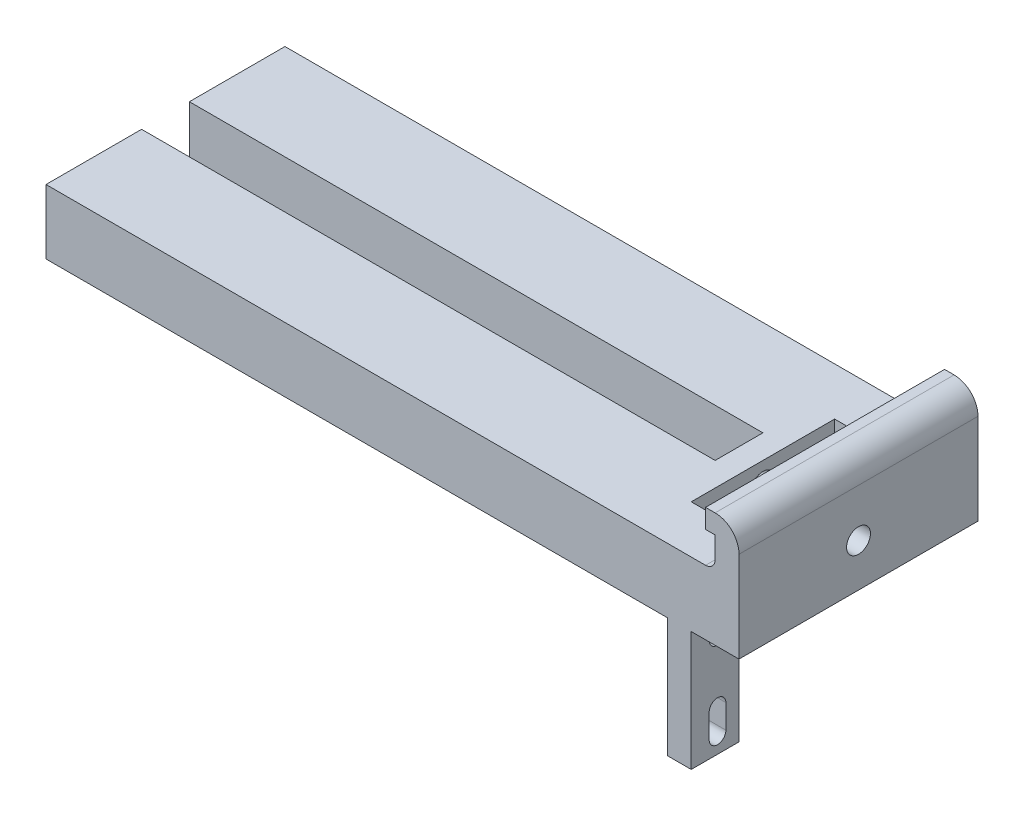
ISO-10303-21;
HEADER;
FILE_DESCRIPTION(('STEP AP214'),'2;1');
FILE_NAME('part.step','',(''),(''),'','','');
FILE_SCHEMA(('AUTOMOTIVE_DESIGN { 1 0 10303 214 1 1 1 1 }'));
ENDSEC;
DATA;
#1=APPLICATION_CONTEXT('core data for automotive mechanical design processes');
#2=APPLICATION_PROTOCOL_DEFINITION('international standard','automotive_design',2000,#1);
#3=PRODUCT_CONTEXT('',#1,'mechanical');
#4=PRODUCT('Part','Part','',(#3));
#5=PRODUCT_RELATED_PRODUCT_CATEGORY('part','',(#4));
#6=PRODUCT_DEFINITION_FORMATION('','',#4);
#7=PRODUCT_DEFINITION_CONTEXT('part definition',#1,'design');
#8=PRODUCT_DEFINITION('design','',#6,#7);
#9=PRODUCT_DEFINITION_SHAPE('','',#8);
#10=(LENGTH_UNIT() NAMED_UNIT(*) SI_UNIT(.MILLI.,.METRE.));
#11=(NAMED_UNIT(*) PLANE_ANGLE_UNIT() SI_UNIT($,.RADIAN.));
#12=(NAMED_UNIT(*) SI_UNIT($,.STERADIAN.) SOLID_ANGLE_UNIT());
#13=UNCERTAINTY_MEASURE_WITH_UNIT(LENGTH_MEASURE(1.E-05),#10,'distance_accuracy_value','');
#14=(GEOMETRIC_REPRESENTATION_CONTEXT(3) GLOBAL_UNCERTAINTY_ASSIGNED_CONTEXT((#13)) GLOBAL_UNIT_ASSIGNED_CONTEXT((#10,
#11,#12)) REPRESENTATION_CONTEXT('',''));
#15=CARTESIAN_POINT('',(0.,0.,0.));
#16=DIRECTION('',(0.,0.,1.));
#17=DIRECTION('',(1.,0.,0.));
#18=AXIS2_PLACEMENT_3D('',#15,#16,#17);
#19=CARTESIAN_POINT('',(0.,0.,50.));
#20=DIRECTION('',(0.,1.,0.));
#21=DIRECTION('',(0.,0.,1.));
#22=AXIS2_PLACEMENT_3D('',#19,#20,#21);
#23=PLANE('',#22);
#24=DIRECTION('',(0.,0.,1.));
#25=VECTOR('',#24,1.);
#26=CARTESIAN_POINT('',(-5.,0.,40.));
#27=LINE('',#26,#25);
#28=CARTESIAN_POINT('',(-5.,0.,40.));
#29=VERTEX_POINT('',#28);
#30=CARTESIAN_POINT('',(-5.,0.,50.));
#31=VERTEX_POINT('',#30);
#32=EDGE_CURVE('E351',#29,#31,#27,.T.);
#33=ORIENTED_EDGE('',*,*,#32,.F.);
#34=DIRECTION('',(0.,0.,-1.));
#35=VECTOR('',#34,1.);
#36=CARTESIAN_POINT('',(-5.,0.,50.));
#37=LINE('',#36,#35);
#38=CARTESIAN_POINT('',(-5.,0.,10.));
#39=VERTEX_POINT('',#38);
#40=EDGE_CURVE('E312',#29,#39,#37,.T.);
#41=ORIENTED_EDGE('',*,*,#40,.T.);
#42=DIRECTION('',(-1.,0.,0.));
#43=VECTOR('',#42,1.);
#44=CARTESIAN_POINT('',(0.,0.,10.));
#45=LINE('',#44,#43);
#46=CARTESIAN_POINT('',(-15.,0.,10.));
#47=VERTEX_POINT('',#46);
#48=EDGE_CURVE('E309',#39,#47,#45,.T.);
#49=ORIENTED_EDGE('',*,*,#48,.T.);
#50=DIRECTION('',(0.,0.,1.));
#51=VECTOR('',#50,1.);
#52=CARTESIAN_POINT('',(-15.,0.,50.));
#53=LINE('',#52,#51);
#54=CARTESIAN_POINT('',(-15.,0.,40.));
#55=VERTEX_POINT('',#54);
#56=EDGE_CURVE('E212',#47,#55,#53,.T.);
#57=ORIENTED_EDGE('',*,*,#56,.T.);
#58=DIRECTION('',(1.,0.,0.));
#59=VECTOR('',#58,1.);
#60=CARTESIAN_POINT('',(0.,0.,40.));
#61=LINE('',#60,#59);
#62=CARTESIAN_POINT('',(-10.,0.,40.));
#63=VERTEX_POINT('',#62);
#64=EDGE_CURVE('E315',#55,#63,#61,.T.);
#65=ORIENTED_EDGE('',*,*,#64,.T.);
#66=DIRECTION('',(0.,0.,-1.));
#67=VECTOR('',#66,1.);
#68=CARTESIAN_POINT('',(-10.,0.,40.));
#69=LINE('',#68,#67);
#70=CARTESIAN_POINT('',(-10.,0.,50.));
#71=VERTEX_POINT('',#70);
#72=EDGE_CURVE('E356',#71,#63,#69,.T.);
#73=ORIENTED_EDGE('',*,*,#72,.F.);
#74=DIRECTION('',(1.,0.,0.));
#75=VECTOR('',#74,1.);
#76=CARTESIAN_POINT('',(0.,0.,50.));
#77=LINE('',#76,#75);
#78=CARTESIAN_POINT('',(-140.,0.,50.));
#79=VERTEX_POINT('',#78);
#80=EDGE_CURVE('E293',#79,#71,#77,.T.);
#81=ORIENTED_EDGE('',*,*,#80,.F.);
#82=DIRECTION('',(0.,0.,-1.));
#83=VECTOR('',#82,1.);
#84=CARTESIAN_POINT('',(-140.,0.,50.));
#85=LINE('',#84,#83);
#86=CARTESIAN_POINT('',(-140.,0.,30.));
#87=VERTEX_POINT('',#86);
#88=EDGE_CURVE('E302',#79,#87,#85,.T.);
#89=ORIENTED_EDGE('',*,*,#88,.T.);
#90=DIRECTION('',(1.,0.,0.));
#91=VECTOR('',#90,1.);
#92=CARTESIAN_POINT('',(-140.,0.,30.));
#93=LINE('',#92,#91);
#94=CARTESIAN_POINT('',(-20.,0.,30.));
#95=VERTEX_POINT('',#94);
#96=EDGE_CURVE('E377',#87,#95,#93,.T.);
#97=ORIENTED_EDGE('',*,*,#96,.T.);
#98=DIRECTION('',(0.,0.,-1.));
#99=VECTOR('',#98,1.);
#100=CARTESIAN_POINT('',(-20.,0.,19.9999999999999));
#101=LINE('',#100,#99);
#102=CARTESIAN_POINT('',(-20.,0.,19.9999999999999));
#103=VERTEX_POINT('',#102);
#104=EDGE_CURVE('E380',#95,#103,#101,.T.);
#105=ORIENTED_EDGE('',*,*,#104,.T.);
#106=DIRECTION('',(-1.,0.,0.));
#107=VECTOR('',#106,1.);
#108=CARTESIAN_POINT('',(-140.,0.,20.));
#109=LINE('',#108,#107);
#110=CARTESIAN_POINT('',(-140.,0.,20.));
#111=VERTEX_POINT('',#110);
#112=EDGE_CURVE('E383',#103,#111,#109,.T.);
#113=ORIENTED_EDGE('',*,*,#112,.T.);
#114=CARTESIAN_POINT('',(-140.,0.,0.));
#115=VERTEX_POINT('',#114);
#116=EDGE_CURVE('E296',#111,#115,#85,.T.);
#117=ORIENTED_EDGE('',*,*,#116,.T.);
#118=DIRECTION('',(1.,0.,0.));
#119=VECTOR('',#118,1.);
#120=CARTESIAN_POINT('',(0.,0.,0.));
#121=LINE('',#120,#119);
#122=CARTESIAN_POINT('',(5.,0.,0.));
#123=VERTEX_POINT('',#122);
#124=EDGE_CURVE('E291',#115,#123,#121,.T.);
#125=ORIENTED_EDGE('',*,*,#124,.T.);
#126=DIRECTION('',(0.,0.,-1.));
#127=VECTOR('',#126,1.);
#128=CARTESIAN_POINT('',(5.,0.,0.));
#129=LINE('',#128,#127);
#130=CARTESIAN_POINT('',(5.,0.,50.));
#131=VERTEX_POINT('',#130);
#132=EDGE_CURVE('E264',#131,#123,#129,.T.);
#133=ORIENTED_EDGE('',*,*,#132,.F.);
#134=EDGE_CURVE('E258',#31,#131,#77,.T.);
#135=ORIENTED_EDGE('',*,*,#134,.F.);
#136=EDGE_LOOP('',(#33,#41,#49,#57,#65,#73,#81,#89,#97,#105,#113,#117,#125,#133,#135));
#137=FACE_BOUND('',#136,.T.);
#138=ADVANCED_FACE('F33',(#137),#23,.F.);
#139=CARTESIAN_POINT('',(-140.,0.,50.));
#140=DIRECTION('',(1.,0.,0.));
#141=DIRECTION('',(0.,0.,-1.));
#142=AXIS2_PLACEMENT_3D('',#139,#140,#141);
#143=PLANE('',#142);
#144=CARTESIAN_POINT('',(-140.,6.75,12.5));
#145=DIRECTION('',(-1.,0.,0.));
#146=DIRECTION('',(0.,0.,1.));
#147=AXIS2_PLACEMENT_3D('',#144,#145,#146);
#148=CIRCLE('',#147,3.);
#149=CARTESIAN_POINT('',(-140.,6.75,15.5));
#150=VERTEX_POINT('',#149);
#151=EDGE_CURVE('E280',#150,#150,#148,.T.);
#152=ORIENTED_EDGE('',*,*,#151,.F.);
#153=EDGE_LOOP('',(#152));
#154=FACE_BOUND('',#153,.T.);
#155=ORIENTED_EDGE('',*,*,#116,.F.);
#156=DIRECTION('',(0.,1.,0.));
#157=VECTOR('',#156,1.);
#158=CARTESIAN_POINT('',(-140.,0.,20.));
#159=LINE('',#158,#157);
#160=CARTESIAN_POINT('',(-140.,13.5,20.));
#161=VERTEX_POINT('',#160);
#162=EDGE_CURVE('E327',#111,#161,#159,.T.);
#163=ORIENTED_EDGE('',*,*,#162,.T.);
#164=DIRECTION('',(0.,0.,-1.));
#165=VECTOR('',#164,1.);
#166=CARTESIAN_POINT('',(-140.,13.5,50.));
#167=LINE('',#166,#165);
#168=CARTESIAN_POINT('',(-140.,13.5,0.));
#169=VERTEX_POINT('',#168);
#170=EDGE_CURVE('E305',#161,#169,#167,.T.);
#171=ORIENTED_EDGE('',*,*,#170,.T.);
#172=DIRECTION('',(0.,-1.,0.));
#173=VECTOR('',#172,1.);
#174=CARTESIAN_POINT('',(-140.,0.,0.));
#175=LINE('',#174,#173);
#176=EDGE_CURVE('E298',#169,#115,#175,.T.);
#177=ORIENTED_EDGE('',*,*,#176,.T.);
#178=EDGE_LOOP('',(#155,#163,#171,#177));
#179=FACE_BOUND('',#178,.T.);
#180=ADVANCED_FACE('F461',(#154,#179),#143,.F.);
#181=CARTESIAN_POINT('',(0.,0.,0.));
#182=DIRECTION('',(-1.,0.,0.));
#183=DIRECTION('',(0.,-1.,0.));
#184=AXIS2_PLACEMENT_3D('',#181,#182,#183);
#185=PLANE('',#184);
#186=DIRECTION('',(0.,1.,0.));
#187=VECTOR('',#186,1.);
#188=CARTESIAN_POINT('',(0.,0.,0.));
#189=LINE('',#188,#187);
#190=CARTESIAN_POINT('',(0.,15.5,0.));
#191=VERTEX_POINT('',#190);
#192=CARTESIAN_POINT('',(0.,20.,0.));
#193=VERTEX_POINT('',#192);
#194=EDGE_CURVE('E268',#191,#193,#189,.T.);
#195=ORIENTED_EDGE('',*,*,#194,.F.);
#196=DIRECTION('',(0.,0.,-1.));
#197=VECTOR('',#196,1.);
#198=CARTESIAN_POINT('',(0.,15.5,0.));
#199=LINE('',#198,#197);
#200=CARTESIAN_POINT('',(0.,15.5,50.));
#201=VERTEX_POINT('',#200);
#202=EDGE_CURVE('E236',#191,#201,#199,.F.);
#203=ORIENTED_EDGE('',*,*,#202,.T.);
#204=DIRECTION('',(0.,-1.,0.));
#205=VECTOR('',#204,1.);
#206=CARTESIAN_POINT('',(0.,0.,50.));
#207=LINE('',#206,#205);
#208=CARTESIAN_POINT('',(0.,20.,50.));
#209=VERTEX_POINT('',#208);
#210=EDGE_CURVE('E270',#209,#201,#207,.T.);
#211=ORIENTED_EDGE('',*,*,#210,.F.);
#212=DIRECTION('',(0.,0.,1.));
#213=VECTOR('',#212,1.);
#214=CARTESIAN_POINT('',(0.,20.,50.));
#215=LINE('',#214,#213);
#216=EDGE_CURVE('E404',#193,#209,#215,.T.);
#217=ORIENTED_EDGE('',*,*,#216,.F.);
#218=EDGE_LOOP('',(#195,#203,#211,#217));
#219=FACE_BOUND('',#218,.T.);
#220=ADVANCED_FACE('F466',(#219),#185,.T.);
#221=CARTESIAN_POINT('',(-140.,13.5,50.));
#222=DIRECTION('',(0.,-1.,0.));
#223=DIRECTION('',(0.,0.,-1.));
#224=AXIS2_PLACEMENT_3D('',#221,#222,#223);
#225=PLANE('',#224);
#226=DIRECTION('',(-1.,0.,0.));
#227=VECTOR('',#226,1.);
#228=CARTESIAN_POINT('',(-140.,13.5,40.));
#229=LINE('',#228,#227);
#230=CARTESIAN_POINT('',(-5.,13.5,40.));
#231=VERTEX_POINT('',#230);
#232=CARTESIAN_POINT('',(-15.,13.5,40.));
#233=VERTEX_POINT('',#232);
#234=EDGE_CURVE('E443',#231,#233,#229,.T.);
#235=ORIENTED_EDGE('',*,*,#234,.T.);
#236=DIRECTION('',(0.,0.,-1.));
#237=VECTOR('',#236,1.);
#238=CARTESIAN_POINT('',(-15.,13.5,50.));
#239=LINE('',#238,#237);
#240=CARTESIAN_POINT('',(-15.,13.5,10.));
#241=VERTEX_POINT('',#240);
#242=EDGE_CURVE('E271',#233,#241,#239,.T.);
#243=ORIENTED_EDGE('',*,*,#242,.T.);
#244=DIRECTION('',(1.,0.,0.));
#245=VECTOR('',#244,1.);
#246=CARTESIAN_POINT('',(-140.,13.5,10.));
#247=LINE('',#246,#245);
#248=CARTESIAN_POINT('',(-5.,13.5,10.));
#249=VERTEX_POINT('',#248);
#250=EDGE_CURVE('E430',#241,#249,#247,.T.);
#251=ORIENTED_EDGE('',*,*,#250,.T.);
#252=DIRECTION('',(0.,0.,1.));
#253=VECTOR('',#252,1.);
#254=CARTESIAN_POINT('',(-5.,13.5,50.));
#255=LINE('',#254,#253);
#256=EDGE_CURVE('E440',#249,#231,#255,.T.);
#257=ORIENTED_EDGE('',*,*,#256,.T.);
#258=EDGE_LOOP('',(#235,#243,#251,#257));
#259=FACE_BOUND('',#258,.T.);
#260=DIRECTION('',(-1.,0.,0.));
#261=VECTOR('',#260,1.);
#262=CARTESIAN_POINT('',(-140.,13.5,50.));
#263=LINE('',#262,#261);
#264=CARTESIAN_POINT('',(-2.,13.5,50.));
#265=VERTEX_POINT('',#264);
#266=CARTESIAN_POINT('',(-140.,13.5,50.));
#267=VERTEX_POINT('',#266);
#268=EDGE_CURVE('E288',#265,#267,#263,.T.);
#269=ORIENTED_EDGE('',*,*,#268,.F.);
#270=DIRECTION('',(0.,0.,-1.));
#271=VECTOR('',#270,1.);
#272=CARTESIAN_POINT('',(-2.,13.5,50.));
#273=LINE('',#272,#271);
#274=CARTESIAN_POINT('',(-2.,13.5,0.));
#275=VERTEX_POINT('',#274);
#276=EDGE_CURVE('E233',#265,#275,#273,.T.);
#277=ORIENTED_EDGE('',*,*,#276,.T.);
#278=DIRECTION('',(-1.,0.,0.));
#279=VECTOR('',#278,1.);
#280=CARTESIAN_POINT('',(-140.,13.5,0.));
#281=LINE('',#280,#279);
#282=EDGE_CURVE('E279',#275,#169,#281,.T.);
#283=ORIENTED_EDGE('',*,*,#282,.T.);
#284=ORIENTED_EDGE('',*,*,#170,.F.);
#285=DIRECTION('',(1.,0.,0.));
#286=VECTOR('',#285,1.);
#287=CARTESIAN_POINT('',(-140.,13.5,20.));
#288=LINE('',#287,#286);
#289=CARTESIAN_POINT('',(-20.,13.5,19.9999999999999));
#290=VERTEX_POINT('',#289);
#291=EDGE_CURVE('E401',#161,#290,#288,.T.);
#292=ORIENTED_EDGE('',*,*,#291,.T.);
#293=DIRECTION('',(0.,0.,1.));
#294=VECTOR('',#293,1.);
#295=CARTESIAN_POINT('',(-20.,13.5,50.));
#296=LINE('',#295,#294);
#297=CARTESIAN_POINT('',(-20.,13.5,30.));
#298=VERTEX_POINT('',#297);
#299=EDGE_CURVE('E326',#290,#298,#296,.T.);
#300=ORIENTED_EDGE('',*,*,#299,.T.);
#301=DIRECTION('',(-1.,0.,0.));
#302=VECTOR('',#301,1.);
#303=CARTESIAN_POINT('',(-140.,13.5,30.));
#304=LINE('',#303,#302);
#305=CARTESIAN_POINT('',(-140.,13.5,30.));
#306=VERTEX_POINT('',#305);
#307=EDGE_CURVE('E398',#298,#306,#304,.T.);
#308=ORIENTED_EDGE('',*,*,#307,.T.);
#309=EDGE_CURVE('E306',#267,#306,#167,.T.);
#310=ORIENTED_EDGE('',*,*,#309,.F.);
#311=EDGE_LOOP('',(#269,#277,#283,#284,#292,#300,#308,#310));
#312=FACE_BOUND('',#311,.T.);
#313=ADVANCED_FACE('F474',(#259,#312),#225,.F.);
#314=CARTESIAN_POINT('',(-140.,6.75,37.5));
#315=DIRECTION('',(-1.,0.,0.));
#316=DIRECTION('',(0.,0.,1.));
#317=AXIS2_PLACEMENT_3D('',#314,#315,#316);
#318=CIRCLE('',#317,3.);
#319=CARTESIAN_POINT('',(-140.,6.75,40.5));
#320=VERTEX_POINT('',#319);
#321=EDGE_CURVE('E275',#320,#320,#318,.T.);
#322=ORIENTED_EDGE('',*,*,#321,.F.);
#323=EDGE_LOOP('',(#322));
#324=FACE_BOUND('',#323,.T.);
#325=ORIENTED_EDGE('',*,*,#309,.T.);
#326=DIRECTION('',(0.,1.,0.));
#327=VECTOR('',#326,1.);
#328=CARTESIAN_POINT('',(-140.,0.,30.));
#329=LINE('',#328,#327);
#330=EDGE_CURVE('E386',#87,#306,#329,.T.);
#331=ORIENTED_EDGE('',*,*,#330,.F.);
#332=ORIENTED_EDGE('',*,*,#88,.F.);
#333=DIRECTION('',(0.,-1.,0.));
#334=VECTOR('',#333,1.);
#335=CARTESIAN_POINT('',(-140.,0.,50.));
#336=LINE('',#335,#334);
#337=EDGE_CURVE('E290',#267,#79,#336,.T.);
#338=ORIENTED_EDGE('',*,*,#337,.F.);
#339=EDGE_LOOP('',(#325,#331,#332,#338));
#340=FACE_BOUND('',#339,.T.);
#341=ADVANCED_FACE('F469',(#324,#340),#143,.F.);
#342=CARTESIAN_POINT('',(0.,0.,50.));
#343=DIRECTION('',(0.,0.,-1.));
#344=DIRECTION('',(-1.,0.,0.));
#345=AXIS2_PLACEMENT_3D('',#342,#343,#344);
#346=PLANE('',#345);
#347=DIRECTION('',(0.,-1.,0.));
#348=VECTOR('',#347,1.);
#349=CARTESIAN_POINT('',(5.,0.,50.));
#350=LINE('',#349,#348);
#351=CARTESIAN_POINT('',(5.,19.,50.));
#352=VERTEX_POINT('',#351);
#353=EDGE_CURVE('E250',#352,#131,#350,.T.);
#354=ORIENTED_EDGE('',*,*,#353,.F.);
#355=CARTESIAN_POINT('',(0.,19.,50.));
#356=DIRECTION('',(0.,0.,-1.));
#357=DIRECTION('',(-1.,0.,0.));
#358=AXIS2_PLACEMENT_3D('',#355,#356,#357);
#359=CIRCLE('',#358,5.);
#360=CARTESIAN_POINT('',(0.,24.,50.));
#361=VERTEX_POINT('',#360);
#362=EDGE_CURVE('E55',#352,#361,#359,.F.);
#363=ORIENTED_EDGE('',*,*,#362,.T.);
#364=DIRECTION('',(-1.,0.,0.));
#365=VECTOR('',#364,1.);
#366=CARTESIAN_POINT('',(5.,24.,50.));
#367=LINE('',#366,#365);
#368=CARTESIAN_POINT('',(-2.,24.,50.));
#369=VERTEX_POINT('',#368);
#370=EDGE_CURVE('E260',#361,#369,#367,.T.);
#371=ORIENTED_EDGE('',*,*,#370,.T.);
#372=DIRECTION('',(0.,1.,0.));
#373=VECTOR('',#372,1.);
#374=CARTESIAN_POINT('',(-2.,20.,50.));
#375=LINE('',#374,#373);
#376=CARTESIAN_POINT('',(-2.,20.,50.));
#377=VERTEX_POINT('',#376);
#378=EDGE_CURVE('E405',#377,#369,#375,.T.);
#379=ORIENTED_EDGE('',*,*,#378,.F.);
#380=DIRECTION('',(1.,0.,0.));
#381=VECTOR('',#380,1.);
#382=CARTESIAN_POINT('',(-2.,20.,50.));
#383=LINE('',#382,#381);
#384=EDGE_CURVE('E415',#377,#209,#383,.T.);
#385=ORIENTED_EDGE('',*,*,#384,.T.);
#386=ORIENTED_EDGE('',*,*,#210,.T.);
#387=CARTESIAN_POINT('',(-2.,15.5,50.));
#388=DIRECTION('',(0.,0.,-1.));
#389=DIRECTION('',(-1.,0.,0.));
#390=AXIS2_PLACEMENT_3D('',#387,#388,#389);
#391=CIRCLE('',#390,2.);
#392=EDGE_CURVE('E240',#201,#265,#391,.T.);
#393=ORIENTED_EDGE('',*,*,#392,.T.);
#394=ORIENTED_EDGE('',*,*,#268,.T.);
#395=ORIENTED_EDGE('',*,*,#337,.T.);
#396=ORIENTED_EDGE('',*,*,#80,.T.);
#397=DIRECTION('',(0.,1.,0.));
#398=VECTOR('',#397,1.);
#399=CARTESIAN_POINT('',(-10.,-25.,50.));
#400=LINE('',#399,#398);
#401=CARTESIAN_POINT('',(-10.,-25.,50.));
#402=VERTEX_POINT('',#401);
#403=EDGE_CURVE('E372',#402,#71,#400,.T.);
#404=ORIENTED_EDGE('',*,*,#403,.F.);
#405=DIRECTION('',(-1.,0.,0.));
#406=VECTOR('',#405,1.);
#407=CARTESIAN_POINT('',(-5.,-25.,50.));
#408=LINE('',#407,#406);
#409=CARTESIAN_POINT('',(-5.,-25.,50.));
#410=VERTEX_POINT('',#409);
#411=EDGE_CURVE('E355',#410,#402,#408,.T.);
#412=ORIENTED_EDGE('',*,*,#411,.F.);
#413=DIRECTION('',(0.,1.,0.));
#414=VECTOR('',#413,1.);
#415=CARTESIAN_POINT('',(-5.,-25.,50.));
#416=LINE('',#415,#414);
#417=EDGE_CURVE('E375',#410,#31,#416,.T.);
#418=ORIENTED_EDGE('',*,*,#417,.T.);
#419=ORIENTED_EDGE('',*,*,#134,.T.);
#420=EDGE_LOOP('',(#354,#363,#371,#379,#385,#386,#393,#394,#395,#396,#404,#412,#418,#419));
#421=FACE_BOUND('',#420,.T.);
#422=ADVANCED_FACE('F256',(#421),#346,.F.);
#423=CARTESIAN_POINT('',(0.,0.,0.));
#424=DIRECTION('',(0.,0.,-1.));
#425=DIRECTION('',(-1.,0.,0.));
#426=AXIS2_PLACEMENT_3D('',#423,#424,#425);
#427=PLANE('',#426);
#428=DIRECTION('',(-1.,0.,0.));
#429=VECTOR('',#428,1.);
#430=CARTESIAN_POINT('',(5.,24.,0.));
#431=LINE('',#430,#429);
#432=CARTESIAN_POINT('',(0.,24.,0.));
#433=VERTEX_POINT('',#432);
#434=CARTESIAN_POINT('',(-2.,24.,0.));
#435=VERTEX_POINT('',#434);
#436=EDGE_CURVE('E262',#433,#435,#431,.T.);
#437=ORIENTED_EDGE('',*,*,#436,.F.);
#438=CARTESIAN_POINT('',(0.,19.,0.));
#439=DIRECTION('',(0.,0.,-1.));
#440=DIRECTION('',(-1.,0.,0.));
#441=AXIS2_PLACEMENT_3D('',#438,#439,#440);
#442=CIRCLE('',#441,5.);
#443=CARTESIAN_POINT('',(5.,19.,0.));
#444=VERTEX_POINT('',#443);
#445=EDGE_CURVE('E11',#433,#444,#442,.T.);
#446=ORIENTED_EDGE('',*,*,#445,.T.);
#447=DIRECTION('',(0.,1.,0.));
#448=VECTOR('',#447,1.);
#449=CARTESIAN_POINT('',(5.,0.,0.));
#450=LINE('',#449,#448);
#451=EDGE_CURVE('E253',#123,#444,#450,.T.);
#452=ORIENTED_EDGE('',*,*,#451,.F.);
#453=ORIENTED_EDGE('',*,*,#124,.F.);
#454=ORIENTED_EDGE('',*,*,#176,.F.);
#455=ORIENTED_EDGE('',*,*,#282,.F.);
#456=CARTESIAN_POINT('',(-2.,15.5,0.));
#457=DIRECTION('',(0.,0.,-1.));
#458=DIRECTION('',(-1.,0.,0.));
#459=AXIS2_PLACEMENT_3D('',#456,#457,#458);
#460=CIRCLE('',#459,2.);
#461=EDGE_CURVE('E238',#275,#191,#460,.F.);
#462=ORIENTED_EDGE('',*,*,#461,.T.);
#463=ORIENTED_EDGE('',*,*,#194,.T.);
#464=DIRECTION('',(1.,0.,0.));
#465=VECTOR('',#464,1.);
#466=CARTESIAN_POINT('',(-2.,20.,0.));
#467=LINE('',#466,#465);
#468=CARTESIAN_POINT('',(-2.,20.,0.));
#469=VERTEX_POINT('',#468);
#470=EDGE_CURVE('E419',#469,#193,#467,.T.);
#471=ORIENTED_EDGE('',*,*,#470,.F.);
#472=DIRECTION('',(0.,-1.,0.));
#473=VECTOR('',#472,1.);
#474=CARTESIAN_POINT('',(-2.,20.,0.));
#475=LINE('',#474,#473);
#476=EDGE_CURVE('E411',#435,#469,#475,.T.);
#477=ORIENTED_EDGE('',*,*,#476,.F.);
#478=EDGE_LOOP('',(#437,#446,#452,#453,#454,#455,#462,#463,#471,#477));
#479=FACE_BOUND('',#478,.T.);
#480=ADVANCED_FACE('F452',(#479),#427,.T.);
#481=CARTESIAN_POINT('',(-135.,6.75,37.5));
#482=DIRECTION('',(-1.,0.,0.));
#483=DIRECTION('',(0.,0.,1.));
#484=AXIS2_PLACEMENT_3D('',#481,#482,#483);
#485=CYLINDRICAL_SURFACE('',#484,3.);
#486=CARTESIAN_POINT('',(-135.,6.75,37.5));
#487=DIRECTION('',(-1.,0.,0.));
#488=DIRECTION('',(0.,0.,1.));
#489=AXIS2_PLACEMENT_3D('',#486,#487,#488);
#490=CIRCLE('',#489,3.);
#491=CARTESIAN_POINT('',(-135.,6.75,40.5));
#492=VERTEX_POINT('',#491);
#493=EDGE_CURVE('E283',#492,#492,#490,.T.);
#494=ORIENTED_EDGE('',*,*,#493,.F.);
#495=EDGE_LOOP('',(#494));
#496=FACE_BOUND('',#495,.T.);
#497=ORIENTED_EDGE('',*,*,#321,.T.);
#498=EDGE_LOOP('',(#497));
#499=FACE_BOUND('',#498,.T.);
#500=ADVANCED_FACE('F524',(#496,#499),#485,.F.);
#501=CARTESIAN_POINT('',(-135.,6.75,37.5));
#502=DIRECTION('',(-1.,0.,0.));
#503=DIRECTION('',(0.,0.,1.));
#504=AXIS2_PLACEMENT_3D('',#501,#502,#503);
#505=PLANE('',#504);
#506=ORIENTED_EDGE('',*,*,#493,.T.);
#507=EDGE_LOOP('',(#506));
#508=FACE_BOUND('',#507,.T.);
#509=ADVANCED_FACE('F520',(#508),#505,.T.);
#510=CARTESIAN_POINT('',(-135.,6.75,12.5));
#511=DIRECTION('',(-1.,0.,0.));
#512=DIRECTION('',(0.,0.,1.));
#513=AXIS2_PLACEMENT_3D('',#510,#511,#512);
#514=CYLINDRICAL_SURFACE('',#513,3.);
#515=CARTESIAN_POINT('',(-135.,6.75,12.5));
#516=DIRECTION('',(-1.,0.,0.));
#517=DIRECTION('',(0.,0.,1.));
#518=AXIS2_PLACEMENT_3D('',#515,#516,#517);
#519=CIRCLE('',#518,3.);
#520=CARTESIAN_POINT('',(-135.,6.75,15.5));
#521=VERTEX_POINT('',#520);
#522=EDGE_CURVE('E276',#521,#521,#519,.T.);
#523=ORIENTED_EDGE('',*,*,#522,.F.);
#524=EDGE_LOOP('',(#523));
#525=FACE_BOUND('',#524,.T.);
#526=ORIENTED_EDGE('',*,*,#151,.T.);
#527=EDGE_LOOP('',(#526));
#528=FACE_BOUND('',#527,.T.);
#529=ADVANCED_FACE('F514',(#525,#528),#514,.F.);
#530=CARTESIAN_POINT('',(-135.,6.75,12.5));
#531=DIRECTION('',(-1.,0.,0.));
#532=DIRECTION('',(0.,0.,1.));
#533=AXIS2_PLACEMENT_3D('',#530,#531,#532);
#534=PLANE('',#533);
#535=ORIENTED_EDGE('',*,*,#522,.T.);
#536=EDGE_LOOP('',(#535));
#537=FACE_BOUND('',#536,.T.);
#538=ADVANCED_FACE('F505',(#537),#534,.T.);
#539=CARTESIAN_POINT('',(5.,24.,50.));
#540=DIRECTION('',(0.,-1.,0.));
#541=DIRECTION('',(0.,0.,-1.));
#542=AXIS2_PLACEMENT_3D('',#539,#540,#541);
#543=PLANE('',#542);
#544=ORIENTED_EDGE('',*,*,#370,.F.);
#545=DIRECTION('',(0.,0.,1.));
#546=VECTOR('',#545,1.);
#547=CARTESIAN_POINT('',(0.,24.,50.));
#548=LINE('',#547,#546);
#549=EDGE_CURVE('E41',#361,#433,#548,.F.);
#550=ORIENTED_EDGE('',*,*,#549,.T.);
#551=ORIENTED_EDGE('',*,*,#436,.T.);
#552=DIRECTION('',(0.,0.,-1.));
#553=VECTOR('',#552,1.);
#554=CARTESIAN_POINT('',(-2.,24.,50.));
#555=LINE('',#554,#553);
#556=EDGE_CURVE('E408',#369,#435,#555,.T.);
#557=ORIENTED_EDGE('',*,*,#556,.F.);
#558=EDGE_LOOP('',(#544,#550,#551,#557));
#559=FACE_BOUND('',#558,.T.);
#560=ADVANCED_FACE('F503',(#559),#543,.F.);
#561=CARTESIAN_POINT('',(5.,0.,0.));
#562=DIRECTION('',(-1.,0.,0.));
#563=DIRECTION('',(0.,-1.,0.));
#564=AXIS2_PLACEMENT_3D('',#561,#562,#563);
#565=PLANE('',#564);
#566=CARTESIAN_POINT('',(5.,8.99999999999999,25.));
#567=DIRECTION('',(1.,0.,0.));
#568=DIRECTION('',(0.,1.,0.));
#569=AXIS2_PLACEMENT_3D('',#566,#567,#568);
#570=CIRCLE('',#569,2.5);
#571=CARTESIAN_POINT('',(5.,11.5,25.));
#572=VERTEX_POINT('',#571);
#573=EDGE_CURVE('E323',#572,#572,#570,.T.);
#574=ORIENTED_EDGE('',*,*,#573,.F.);
#575=EDGE_LOOP('',(#574));
#576=FACE_BOUND('',#575,.T.);
#577=ORIENTED_EDGE('',*,*,#451,.T.);
#578=DIRECTION('',(0.,0.,1.));
#579=VECTOR('',#578,1.);
#580=CARTESIAN_POINT('',(5.,19.,0.));
#581=LINE('',#580,#579);
#582=EDGE_CURVE('E242',#444,#352,#581,.T.);
#583=ORIENTED_EDGE('',*,*,#582,.T.);
#584=ORIENTED_EDGE('',*,*,#353,.T.);
#585=ORIENTED_EDGE('',*,*,#132,.T.);
#586=EDGE_LOOP('',(#577,#583,#584,#585));
#587=FACE_BOUND('',#586,.T.);
#588=ADVANCED_FACE('F248',(#576,#587),#565,.F.);
#589=CARTESIAN_POINT('',(-15.,24.,40.));
#590=DIRECTION('',(-1.,0.,0.));
#591=DIRECTION('',(0.,0.,1.));
#592=AXIS2_PLACEMENT_3D('',#589,#590,#591);
#593=PLANE('',#592);
#594=CARTESIAN_POINT('',(-15.,8.99999999999999,25.));
#595=DIRECTION('',(-1.,0.,0.));
#596=DIRECTION('',(0.,0.,1.));
#597=AXIS2_PLACEMENT_3D('',#594,#595,#596);
#598=CIRCLE('',#597,2.5);
#599=CARTESIAN_POINT('',(-15.,8.99999999999999,27.5));
#600=VERTEX_POINT('',#599);
#601=EDGE_CURVE('E322',#600,#600,#598,.T.);
#602=ORIENTED_EDGE('',*,*,#601,.T.);
#603=EDGE_LOOP('',(#602));
#604=FACE_BOUND('',#603,.T.);
#605=DIRECTION('',(0.,-1.,0.));
#606=VECTOR('',#605,1.);
#607=CARTESIAN_POINT('',(-15.,24.,40.));
#608=LINE('',#607,#606);
#609=EDGE_CURVE('E427',#233,#55,#608,.T.);
#610=ORIENTED_EDGE('',*,*,#609,.T.);
#611=ORIENTED_EDGE('',*,*,#56,.F.);
#612=DIRECTION('',(0.,-1.,0.));
#613=VECTOR('',#612,1.);
#614=CARTESIAN_POINT('',(-15.,24.,10.));
#615=LINE('',#614,#613);
#616=EDGE_CURVE('E426',#241,#47,#615,.T.);
#617=ORIENTED_EDGE('',*,*,#616,.F.);
#618=ORIENTED_EDGE('',*,*,#242,.F.);
#619=EDGE_LOOP('',(#610,#611,#617,#618));
#620=FACE_BOUND('',#619,.T.);
#621=ADVANCED_FACE('F511',(#604,#620),#593,.F.);
#622=CARTESIAN_POINT('',(-15.,24.,40.));
#623=DIRECTION('',(0.,0.,1.));
#624=DIRECTION('',(1.,0.,0.));
#625=AXIS2_PLACEMENT_3D('',#622,#623,#624);
#626=PLANE('',#625);
#627=DIRECTION('',(0.,-1.,0.));
#628=VECTOR('',#627,1.);
#629=CARTESIAN_POINT('',(-5.,24.,40.));
#630=LINE('',#629,#628);
#631=EDGE_CURVE('E431',#231,#29,#630,.T.);
#632=ORIENTED_EDGE('',*,*,#631,.T.);
#633=DIRECTION('',(0.,1.,0.));
#634=VECTOR('',#633,1.);
#635=CARTESIAN_POINT('',(-5.,-25.,40.));
#636=LINE('',#635,#634);
#637=CARTESIAN_POINT('',(-5.,-25.,40.));
#638=VERTEX_POINT('',#637);
#639=EDGE_CURVE('E362',#638,#29,#636,.T.);
#640=ORIENTED_EDGE('',*,*,#639,.F.);
#641=DIRECTION('',(1.,0.,0.));
#642=VECTOR('',#641,1.);
#643=CARTESIAN_POINT('',(-5.,-25.,40.));
#644=LINE('',#643,#642);
#645=CARTESIAN_POINT('',(-10.,-25.,40.));
#646=VERTEX_POINT('',#645);
#647=EDGE_CURVE('E360',#646,#638,#644,.T.);
#648=ORIENTED_EDGE('',*,*,#647,.F.);
#649=DIRECTION('',(0.,1.,0.));
#650=VECTOR('',#649,1.);
#651=CARTESIAN_POINT('',(-10.,-25.,40.));
#652=LINE('',#651,#650);
#653=EDGE_CURVE('E369',#646,#63,#652,.T.);
#654=ORIENTED_EDGE('',*,*,#653,.T.);
#655=ORIENTED_EDGE('',*,*,#64,.F.);
#656=ORIENTED_EDGE('',*,*,#609,.F.);
#657=ORIENTED_EDGE('',*,*,#234,.F.);
#658=EDGE_LOOP('',(#632,#640,#648,#654,#655,#656,#657));
#659=FACE_BOUND('',#658,.T.);
#660=ADVANCED_FACE('F576',(#659),#626,.F.);
#661=CARTESIAN_POINT('',(-5.,24.,40.));
#662=DIRECTION('',(1.,0.,0.));
#663=DIRECTION('',(0.,0.,-1.));
#664=AXIS2_PLACEMENT_3D('',#661,#662,#663);
#665=PLANE('',#664);
#666=CARTESIAN_POINT('',(-5.,8.99999999999999,25.));
#667=DIRECTION('',(1.,0.,0.));
#668=DIRECTION('',(0.,0.,-1.));
#669=AXIS2_PLACEMENT_3D('',#666,#667,#668);
#670=CIRCLE('',#669,2.5);
#671=CARTESIAN_POINT('',(-5.,8.99999999999999,22.5));
#672=VERTEX_POINT('',#671);
#673=EDGE_CURVE('E319',#672,#672,#670,.T.);
#674=ORIENTED_EDGE('',*,*,#673,.T.);
#675=EDGE_LOOP('',(#674));
#676=FACE_BOUND('',#675,.T.);
#677=DIRECTION('',(0.,-1.,0.));
#678=VECTOR('',#677,1.);
#679=CARTESIAN_POINT('',(-5.,24.,10.));
#680=LINE('',#679,#678);
#681=EDGE_CURVE('E434',#249,#39,#680,.T.);
#682=ORIENTED_EDGE('',*,*,#681,.T.);
#683=ORIENTED_EDGE('',*,*,#40,.F.);
#684=ORIENTED_EDGE('',*,*,#631,.F.);
#685=ORIENTED_EDGE('',*,*,#256,.F.);
#686=EDGE_LOOP('',(#682,#683,#684,#685));
#687=FACE_BOUND('',#686,.T.);
#688=ADVANCED_FACE('F562',(#676,#687),#665,.F.);
#689=CARTESIAN_POINT('',(-15.,24.,10.));
#690=DIRECTION('',(0.,0.,-1.));
#691=DIRECTION('',(-1.,0.,0.));
#692=AXIS2_PLACEMENT_3D('',#689,#690,#691);
#693=PLANE('',#692);
#694=ORIENTED_EDGE('',*,*,#616,.T.);
#695=ORIENTED_EDGE('',*,*,#48,.F.);
#696=ORIENTED_EDGE('',*,*,#681,.F.);
#697=ORIENTED_EDGE('',*,*,#250,.F.);
#698=EDGE_LOOP('',(#694,#695,#696,#697));
#699=FACE_BOUND('',#698,.T.);
#700=ADVANCED_FACE('F556',(#699),#693,.F.);
#701=CARTESIAN_POINT('',(-30.,8.99999999999999,25.));
#702=DIRECTION('',(1.,0.,0.));
#703=DIRECTION('',(0.,1.,0.));
#704=AXIS2_PLACEMENT_3D('',#701,#702,#703);
#705=CYLINDRICAL_SURFACE('',#704,2.5);
#706=ORIENTED_EDGE('',*,*,#573,.T.);
#707=EDGE_LOOP('',(#706));
#708=FACE_BOUND('',#707,.T.);
#709=ORIENTED_EDGE('',*,*,#673,.F.);
#710=EDGE_LOOP('',(#709));
#711=FACE_BOUND('',#710,.T.);
#712=ADVANCED_FACE('F561',(#708,#711),#705,.F.);
#713=CARTESIAN_POINT('',(-20.,8.99999999999999,25.));
#714=DIRECTION('',(1.,0.,0.));
#715=DIRECTION('',(0.,0.,-1.));
#716=AXIS2_PLACEMENT_3D('',#713,#714,#715);
#717=CIRCLE('',#716,2.5);
#718=CARTESIAN_POINT('',(-20.,8.99999999999999,22.5));
#719=VERTEX_POINT('',#718);
#720=EDGE_CURVE('E324',#719,#719,#717,.F.);
#721=ORIENTED_EDGE('',*,*,#720,.T.);
#722=EDGE_LOOP('',(#721));
#723=FACE_BOUND('',#722,.T.);
#724=ORIENTED_EDGE('',*,*,#601,.F.);
#725=EDGE_LOOP('',(#724));
#726=FACE_BOUND('',#725,.T.);
#727=ADVANCED_FACE('F587',(#723,#726),#705,.F.);
#728=CARTESIAN_POINT('',(-2.,20.,50.));
#729=DIRECTION('',(0.,1.,0.));
#730=DIRECTION('',(0.,0.,1.));
#731=AXIS2_PLACEMENT_3D('',#728,#729,#730);
#732=PLANE('',#731);
#733=ORIENTED_EDGE('',*,*,#216,.T.);
#734=ORIENTED_EDGE('',*,*,#384,.F.);
#735=DIRECTION('',(0.,0.,1.));
#736=VECTOR('',#735,1.);
#737=CARTESIAN_POINT('',(-2.,20.,50.));
#738=LINE('',#737,#736);
#739=EDGE_CURVE('E413',#469,#377,#738,.T.);
#740=ORIENTED_EDGE('',*,*,#739,.F.);
#741=ORIENTED_EDGE('',*,*,#470,.T.);
#742=EDGE_LOOP('',(#733,#734,#740,#741));
#743=FACE_BOUND('',#742,.T.);
#744=ADVANCED_FACE('F497',(#743),#732,.F.);
#745=CARTESIAN_POINT('',(-2.,0.,0.));
#746=DIRECTION('',(-1.,0.,0.));
#747=DIRECTION('',(0.,-1.,0.));
#748=AXIS2_PLACEMENT_3D('',#745,#746,#747);
#749=PLANE('',#748);
#750=ORIENTED_EDGE('',*,*,#378,.T.);
#751=ORIENTED_EDGE('',*,*,#556,.T.);
#752=ORIENTED_EDGE('',*,*,#476,.T.);
#753=ORIENTED_EDGE('',*,*,#739,.T.);
#754=EDGE_LOOP('',(#750,#751,#752,#753));
#755=FACE_BOUND('',#754,.T.);
#756=ADVANCED_FACE('F502',(#755),#749,.T.);
#757=CARTESIAN_POINT('',(-140.,0.,20.));
#758=DIRECTION('',(0.,0.,-1.));
#759=DIRECTION('',(-1.,0.,0.));
#760=AXIS2_PLACEMENT_3D('',#757,#758,#759);
#761=PLANE('',#760);
#762=ORIENTED_EDGE('',*,*,#162,.F.);
#763=ORIENTED_EDGE('',*,*,#112,.F.);
#764=DIRECTION('',(0.,1.,0.));
#765=VECTOR('',#764,1.);
#766=CARTESIAN_POINT('',(-20.,0.,19.9999999999999));
#767=LINE('',#766,#765);
#768=EDGE_CURVE('E389',#103,#290,#767,.T.);
#769=ORIENTED_EDGE('',*,*,#768,.T.);
#770=ORIENTED_EDGE('',*,*,#291,.F.);
#771=EDGE_LOOP('',(#762,#763,#769,#770));
#772=FACE_BOUND('',#771,.T.);
#773=ADVANCED_FACE('F608',(#772),#761,.F.);
#774=CARTESIAN_POINT('',(-140.,0.,30.));
#775=DIRECTION('',(0.,0.,1.));
#776=DIRECTION('',(1.,0.,0.));
#777=AXIS2_PLACEMENT_3D('',#774,#775,#776);
#778=PLANE('',#777);
#779=DIRECTION('',(0.,1.,0.));
#780=VECTOR('',#779,1.);
#781=CARTESIAN_POINT('',(-20.,0.,30.));
#782=LINE('',#781,#780);
#783=EDGE_CURVE('E392',#95,#298,#782,.T.);
#784=ORIENTED_EDGE('',*,*,#783,.F.);
#785=ORIENTED_EDGE('',*,*,#96,.F.);
#786=ORIENTED_EDGE('',*,*,#330,.T.);
#787=ORIENTED_EDGE('',*,*,#307,.F.);
#788=EDGE_LOOP('',(#784,#785,#786,#787));
#789=FACE_BOUND('',#788,.T.);
#790=ADVANCED_FACE('F638',(#789),#778,.F.);
#791=CARTESIAN_POINT('',(-20.,0.,19.9999999999999));
#792=DIRECTION('',(1.,0.,0.));
#793=DIRECTION('',(0.,0.,-1.));
#794=AXIS2_PLACEMENT_3D('',#791,#792,#793);
#795=PLANE('',#794);
#796=ORIENTED_EDGE('',*,*,#720,.F.);
#797=EDGE_LOOP('',(#796));
#798=FACE_BOUND('',#797,.T.);
#799=ORIENTED_EDGE('',*,*,#768,.F.);
#800=ORIENTED_EDGE('',*,*,#104,.F.);
#801=ORIENTED_EDGE('',*,*,#783,.T.);
#802=ORIENTED_EDGE('',*,*,#299,.F.);
#803=EDGE_LOOP('',(#799,#800,#801,#802));
#804=FACE_BOUND('',#803,.T.);
#805=ADVANCED_FACE('F648',(#798,#804),#795,.F.);
#806=CARTESIAN_POINT('',(-5.,-25.,40.));
#807=DIRECTION('',(-1.,0.,0.));
#808=DIRECTION('',(0.,0.,1.));
#809=AXIS2_PLACEMENT_3D('',#806,#807,#808);
#810=PLANE('',#809);
#811=DIRECTION('',(0.,-1.,0.));
#812=VECTOR('',#811,1.);
#813=CARTESIAN_POINT('',(-5.,-25.,42.7500000000001));
#814=LINE('',#813,#812);
#815=CARTESIAN_POINT('',(-5.,-16.5,42.7500000000001));
#816=VERTEX_POINT('',#815);
#817=CARTESIAN_POINT('',(-5.,-21.5,42.7500000000001));
#818=VERTEX_POINT('',#817);
#819=EDGE_CURVE('E345',#816,#818,#814,.T.);
#820=ORIENTED_EDGE('',*,*,#819,.T.);
#821=CARTESIAN_POINT('',(-5.,-21.5,44.5000000000001));
#822=DIRECTION('',(-1.,0.,0.));
#823=DIRECTION('',(0.,0.,1.));
#824=AXIS2_PLACEMENT_3D('',#821,#822,#823);
#825=CIRCLE('',#824,1.75);
#826=CARTESIAN_POINT('',(-5.,-21.5,46.2500000000001));
#827=VERTEX_POINT('',#826);
#828=EDGE_CURVE('E348',#818,#827,#825,.T.);
#829=ORIENTED_EDGE('',*,*,#828,.T.);
#830=DIRECTION('',(0.,1.,0.));
#831=VECTOR('',#830,1.);
#832=CARTESIAN_POINT('',(-5.,-25.,46.2500000000001));
#833=LINE('',#832,#831);
#834=CARTESIAN_POINT('',(-5.,-16.5,46.2500000000001));
#835=VERTEX_POINT('',#834);
#836=EDGE_CURVE('E334',#827,#835,#833,.T.);
#837=ORIENTED_EDGE('',*,*,#836,.T.);
#838=CARTESIAN_POINT('',(-5.,-16.5,44.5000000000001));
#839=DIRECTION('',(-1.,0.,0.));
#840=DIRECTION('',(0.,0.,1.));
#841=AXIS2_PLACEMENT_3D('',#838,#839,#840);
#842=CIRCLE('',#841,1.75);
#843=EDGE_CURVE('E219',#835,#816,#842,.T.);
#844=ORIENTED_EDGE('',*,*,#843,.T.);
#845=EDGE_LOOP('',(#820,#829,#837,#844));
#846=FACE_BOUND('',#845,.T.);
#847=CARTESIAN_POINT('',(-5.,-3.5,44.5000000000001));
#848=DIRECTION('',(-1.,0.,0.));
#849=DIRECTION('',(0.,0.,1.));
#850=AXIS2_PLACEMENT_3D('',#847,#848,#849);
#851=CIRCLE('',#850,1.75);
#852=CARTESIAN_POINT('',(-5.,-3.5,46.2500000000001));
#853=VERTEX_POINT('',#852);
#854=EDGE_CURVE('E330',#853,#853,#851,.T.);
#855=ORIENTED_EDGE('',*,*,#854,.T.);
#856=EDGE_LOOP('',(#855));
#857=FACE_BOUND('',#856,.T.);
#858=ORIENTED_EDGE('',*,*,#32,.T.);
#859=ORIENTED_EDGE('',*,*,#417,.F.);
#860=DIRECTION('',(0.,0.,1.));
#861=VECTOR('',#860,1.);
#862=CARTESIAN_POINT('',(-5.,-25.,40.));
#863=LINE('',#862,#861);
#864=EDGE_CURVE('E352',#638,#410,#863,.T.);
#865=ORIENTED_EDGE('',*,*,#864,.F.);
#866=ORIENTED_EDGE('',*,*,#639,.T.);
#867=EDGE_LOOP('',(#858,#859,#865,#866));
#868=FACE_BOUND('',#867,.T.);
#869=ADVANCED_FACE('F657',(#846,#857,#868),#810,.F.);
#870=CARTESIAN_POINT('',(-10.,-25.,40.));
#871=DIRECTION('',(1.,0.,0.));
#872=DIRECTION('',(0.,0.,-1.));
#873=AXIS2_PLACEMENT_3D('',#870,#871,#872);
#874=PLANE('',#873);
#875=DIRECTION('',(0.,-1.,0.));
#876=VECTOR('',#875,1.);
#877=CARTESIAN_POINT('',(-10.,-25.,46.2500000000001));
#878=LINE('',#877,#876);
#879=CARTESIAN_POINT('',(-10.,-16.5,46.2500000000001));
#880=VERTEX_POINT('',#879);
#881=CARTESIAN_POINT('',(-10.,-21.5,46.2500000000001));
#882=VERTEX_POINT('',#881);
#883=EDGE_CURVE('E200',#880,#882,#878,.T.);
#884=ORIENTED_EDGE('',*,*,#883,.T.);
#885=CARTESIAN_POINT('',(-10.,-21.5,44.5000000000001));
#886=DIRECTION('',(1.,0.,0.));
#887=DIRECTION('',(0.,0.,-1.));
#888=AXIS2_PLACEMENT_3D('',#885,#886,#887);
#889=CIRCLE('',#888,1.75);
#890=CARTESIAN_POINT('',(-10.,-21.5,42.7500000000001));
#891=VERTEX_POINT('',#890);
#892=EDGE_CURVE('E228',#882,#891,#889,.T.);
#893=ORIENTED_EDGE('',*,*,#892,.T.);
#894=DIRECTION('',(0.,1.,0.));
#895=VECTOR('',#894,1.);
#896=CARTESIAN_POINT('',(-10.,-25.,42.7500000000001));
#897=LINE('',#896,#895);
#898=CARTESIAN_POINT('',(-10.,-16.5,42.7500000000001));
#899=VERTEX_POINT('',#898);
#900=EDGE_CURVE('E226',#891,#899,#897,.T.);
#901=ORIENTED_EDGE('',*,*,#900,.T.);
#902=CARTESIAN_POINT('',(-10.,-16.5,44.5000000000001));
#903=DIRECTION('',(1.,0.,0.));
#904=DIRECTION('',(0.,0.,-1.));
#905=AXIS2_PLACEMENT_3D('',#902,#903,#904);
#906=CIRCLE('',#905,1.75);
#907=EDGE_CURVE('E211',#899,#880,#906,.T.);
#908=ORIENTED_EDGE('',*,*,#907,.T.);
#909=EDGE_LOOP('',(#884,#893,#901,#908));
#910=FACE_BOUND('',#909,.T.);
#911=CARTESIAN_POINT('',(-10.,-3.5,44.5000000000001));
#912=DIRECTION('',(1.,0.,0.));
#913=DIRECTION('',(0.,0.,-1.));
#914=AXIS2_PLACEMENT_3D('',#911,#912,#913);
#915=CIRCLE('',#914,1.75);
#916=CARTESIAN_POINT('',(-10.,-3.5,42.7500000000001));
#917=VERTEX_POINT('',#916);
#918=EDGE_CURVE('E328',#917,#917,#915,.T.);
#919=ORIENTED_EDGE('',*,*,#918,.T.);
#920=EDGE_LOOP('',(#919));
#921=FACE_BOUND('',#920,.T.);
#922=ORIENTED_EDGE('',*,*,#72,.T.);
#923=ORIENTED_EDGE('',*,*,#653,.F.);
#924=DIRECTION('',(0.,0.,-1.));
#925=VECTOR('',#924,1.);
#926=CARTESIAN_POINT('',(-10.,-25.,40.));
#927=LINE('',#926,#925);
#928=EDGE_CURVE('E358',#402,#646,#927,.T.);
#929=ORIENTED_EDGE('',*,*,#928,.F.);
#930=ORIENTED_EDGE('',*,*,#403,.T.);
#931=EDGE_LOOP('',(#922,#923,#929,#930));
#932=FACE_BOUND('',#931,.T.);
#933=ADVANCED_FACE('F224',(#910,#921,#932),#874,.F.);
#934=CARTESIAN_POINT('',(0.,-25.,0.));
#935=DIRECTION('',(0.,-1.,0.));
#936=DIRECTION('',(0.,0.,-1.));
#937=AXIS2_PLACEMENT_3D('',#934,#935,#936);
#938=PLANE('',#937);
#939=ORIENTED_EDGE('',*,*,#864,.T.);
#940=ORIENTED_EDGE('',*,*,#411,.T.);
#941=ORIENTED_EDGE('',*,*,#928,.T.);
#942=ORIENTED_EDGE('',*,*,#647,.T.);
#943=EDGE_LOOP('',(#939,#940,#941,#942));
#944=FACE_BOUND('',#943,.T.);
#945=ADVANCED_FACE('F687',(#944),#938,.T.);
#946=CARTESIAN_POINT('',(5.,-3.5,44.5000000000001));
#947=DIRECTION('',(-1.,0.,0.));
#948=DIRECTION('',(0.,0.,1.));
#949=AXIS2_PLACEMENT_3D('',#946,#947,#948);
#950=CYLINDRICAL_SURFACE('',#949,1.75);
#951=ORIENTED_EDGE('',*,*,#918,.F.);
#952=EDGE_LOOP('',(#951));
#953=FACE_BOUND('',#952,.T.);
#954=ORIENTED_EDGE('',*,*,#854,.F.);
#955=EDGE_LOOP('',(#954));
#956=FACE_BOUND('',#955,.T.);
#957=ADVANCED_FACE('F692',(#953,#956),#950,.F.);
#958=CARTESIAN_POINT('',(5.,-21.5,44.5000000000001));
#959=DIRECTION('',(-1.,0.,0.));
#960=DIRECTION('',(0.,0.,1.));
#961=AXIS2_PLACEMENT_3D('',#958,#959,#960);
#962=CYLINDRICAL_SURFACE('',#961,1.75);
#963=DIRECTION('',(-1.,0.,0.));
#964=VECTOR('',#963,1.);
#965=CARTESIAN_POINT('',(5.,-21.5,42.7500000000001));
#966=LINE('',#965,#964);
#967=EDGE_CURVE('E331',#818,#891,#966,.T.);
#968=ORIENTED_EDGE('',*,*,#967,.T.);
#969=ORIENTED_EDGE('',*,*,#892,.F.);
#970=DIRECTION('',(-1.,0.,0.));
#971=VECTOR('',#970,1.);
#972=CARTESIAN_POINT('',(5.,-21.5,46.2500000000001));
#973=LINE('',#972,#971);
#974=EDGE_CURVE('E206',#827,#882,#973,.T.);
#975=ORIENTED_EDGE('',*,*,#974,.F.);
#976=ORIENTED_EDGE('',*,*,#828,.F.);
#977=EDGE_LOOP('',(#968,#969,#975,#976));
#978=FACE_BOUND('',#977,.T.);
#979=ADVANCED_FACE('F717',(#978),#962,.F.);
#980=CARTESIAN_POINT('',(5.,-21.5,42.7500000000001));
#981=DIRECTION('',(0.,0.,-1.));
#982=DIRECTION('',(-1.,0.,0.));
#983=AXIS2_PLACEMENT_3D('',#980,#981,#982);
#984=PLANE('',#983);
#985=DIRECTION('',(-1.,0.,0.));
#986=VECTOR('',#985,1.);
#987=CARTESIAN_POINT('',(5.,-16.5,42.7500000000001));
#988=LINE('',#987,#986);
#989=EDGE_CURVE('E221',#816,#899,#988,.T.);
#990=ORIENTED_EDGE('',*,*,#989,.T.);
#991=ORIENTED_EDGE('',*,*,#900,.F.);
#992=ORIENTED_EDGE('',*,*,#967,.F.);
#993=ORIENTED_EDGE('',*,*,#819,.F.);
#994=EDGE_LOOP('',(#990,#991,#992,#993));
#995=FACE_BOUND('',#994,.T.);
#996=ADVANCED_FACE('F727',(#995),#984,.F.);
#997=CARTESIAN_POINT('',(5.,-16.5,44.5000000000001));
#998=DIRECTION('',(-1.,0.,0.));
#999=DIRECTION('',(0.,0.,1.));
#1000=AXIS2_PLACEMENT_3D('',#997,#998,#999);
#1001=CYLINDRICAL_SURFACE('',#1000,1.75);
#1002=DIRECTION('',(-1.,0.,0.));
#1003=VECTOR('',#1002,1.);
#1004=CARTESIAN_POINT('',(5.,-16.5,46.2500000000001));
#1005=LINE('',#1004,#1003);
#1006=EDGE_CURVE('E203',#835,#880,#1005,.T.);
#1007=ORIENTED_EDGE('',*,*,#1006,.T.);
#1008=ORIENTED_EDGE('',*,*,#907,.F.);
#1009=ORIENTED_EDGE('',*,*,#989,.F.);
#1010=ORIENTED_EDGE('',*,*,#843,.F.);
#1011=EDGE_LOOP('',(#1007,#1008,#1009,#1010));
#1012=FACE_BOUND('',#1011,.T.);
#1013=ADVANCED_FACE('F215',(#1012),#1001,.F.);
#1014=CARTESIAN_POINT('',(5.,-16.5,46.2500000000001));
#1015=DIRECTION('',(0.,0.,1.));
#1016=DIRECTION('',(1.,0.,0.));
#1017=AXIS2_PLACEMENT_3D('',#1014,#1015,#1016);
#1018=PLANE('',#1017);
#1019=ORIENTED_EDGE('',*,*,#974,.T.);
#1020=ORIENTED_EDGE('',*,*,#883,.F.);
#1021=ORIENTED_EDGE('',*,*,#1006,.F.);
#1022=ORIENTED_EDGE('',*,*,#836,.F.);
#1023=EDGE_LOOP('',(#1019,#1020,#1021,#1022));
#1024=FACE_BOUND('',#1023,.T.);
#1025=ADVANCED_FACE('F202',(#1024),#1018,.F.);
#1026=CARTESIAN_POINT('',(-2.,15.5,50.));
#1027=DIRECTION('',(0.,0.,-1.));
#1028=DIRECTION('',(-1.,0.,0.));
#1029=AXIS2_PLACEMENT_3D('',#1026,#1027,#1028);
#1030=CYLINDRICAL_SURFACE('',#1029,2.);
#1031=ORIENTED_EDGE('',*,*,#392,.F.);
#1032=ORIENTED_EDGE('',*,*,#202,.F.);
#1033=ORIENTED_EDGE('',*,*,#461,.F.);
#1034=ORIENTED_EDGE('',*,*,#276,.F.);
#1035=EDGE_LOOP('',(#1031,#1032,#1033,#1034));
#1036=FACE_BOUND('',#1035,.T.);
#1037=ADVANCED_FACE('F455',(#1036),#1030,.F.);
#1038=CARTESIAN_POINT('',(0.,19.,0.));
#1039=DIRECTION('',(0.,0.,1.));
#1040=DIRECTION('',(0.,-1.,0.));
#1041=AXIS2_PLACEMENT_3D('',#1038,#1039,#1040);
#1042=CYLINDRICAL_SURFACE('',#1041,5.);
#1043=ORIENTED_EDGE('',*,*,#445,.F.);
#1044=ORIENTED_EDGE('',*,*,#549,.F.);
#1045=ORIENTED_EDGE('',*,*,#362,.F.);
#1046=ORIENTED_EDGE('',*,*,#582,.F.);
#1047=EDGE_LOOP('',(#1043,#1044,#1045,#1046));
#1048=FACE_BOUND('',#1047,.T.);
#1049=ADVANCED_FACE('F35',(#1048),#1042,.T.);
#1050=CLOSED_SHELL('',(#138,#180,#220,#313,#341,#422,#480,#500,#509,#529,#538,#560,#588,#621,
#660,#688,#700,#712,#727,#744,#756,#773,#790,#805,#869,#933,#945,#957,#979,#996,#1013,#1025,
#1037,#1049));
#1051=MANIFOLD_SOLID_BREP('B2',#1050);
#1052=ADVANCED_BREP_SHAPE_REPRESENTATION('',(#18,#1051),#14);
#1053=SHAPE_DEFINITION_REPRESENTATION(#9,#1052);
ENDSEC;
END-ISO-10303-21;
